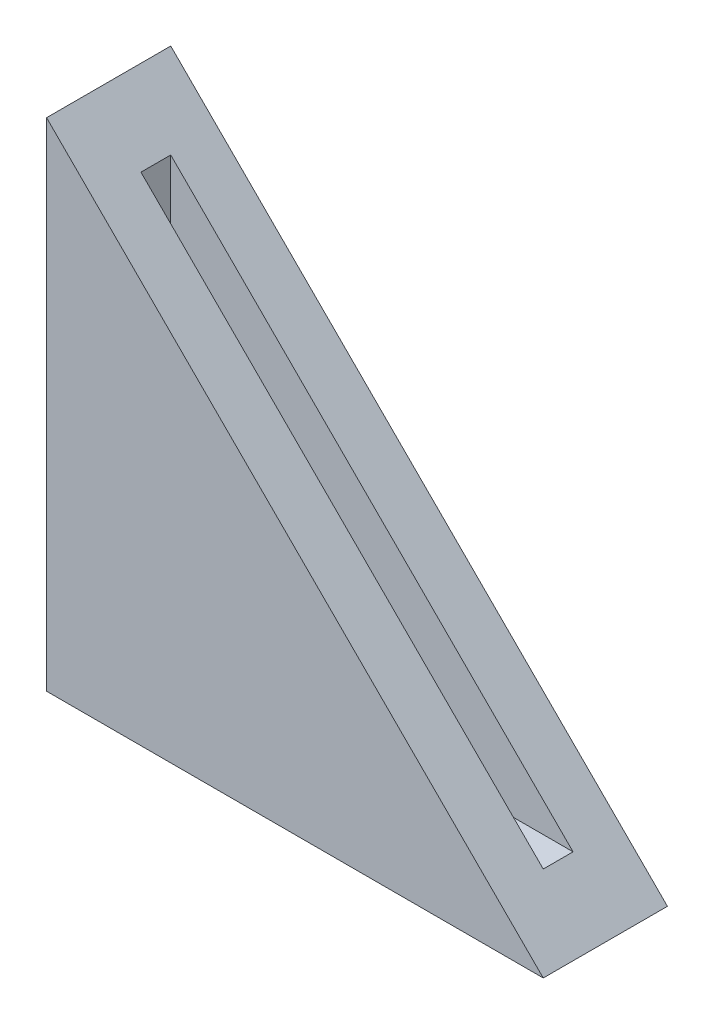
ISO-10303-21;
HEADER;
FILE_DESCRIPTION(('STEP AP214'),'2;1');
FILE_NAME('part.step','',(''),(''),'','','');
FILE_SCHEMA(('AUTOMOTIVE_DESIGN { 1 0 10303 214 1 1 1 1 }'));
ENDSEC;
DATA;
#1=APPLICATION_CONTEXT('core data for automotive mechanical design processes');
#2=APPLICATION_PROTOCOL_DEFINITION('international standard','automotive_design',2000,#1);
#3=PRODUCT_CONTEXT('',#1,'mechanical');
#4=PRODUCT('Part','Part','',(#3));
#5=PRODUCT_RELATED_PRODUCT_CATEGORY('part','',(#4));
#6=PRODUCT_DEFINITION_FORMATION('','',#4);
#7=PRODUCT_DEFINITION_CONTEXT('part definition',#1,'design');
#8=PRODUCT_DEFINITION('design','',#6,#7);
#9=PRODUCT_DEFINITION_SHAPE('','',#8);
#10=(LENGTH_UNIT() NAMED_UNIT(*) SI_UNIT(.MILLI.,.METRE.));
#11=(NAMED_UNIT(*) PLANE_ANGLE_UNIT() SI_UNIT($,.RADIAN.));
#12=(NAMED_UNIT(*) SI_UNIT($,.STERADIAN.) SOLID_ANGLE_UNIT());
#13=UNCERTAINTY_MEASURE_WITH_UNIT(LENGTH_MEASURE(1.E-05),#10,'distance_accuracy_value','');
#14=(GEOMETRIC_REPRESENTATION_CONTEXT(3) GLOBAL_UNCERTAINTY_ASSIGNED_CONTEXT((#13)) GLOBAL_UNIT_ASSIGNED_CONTEXT((#10,
#11,#12)) REPRESENTATION_CONTEXT('',''));
#15=CARTESIAN_POINT('',(0.,0.,0.));
#16=DIRECTION('',(0.,0.,1.));
#17=DIRECTION('',(1.,0.,0.));
#18=AXIS2_PLACEMENT_3D('',#15,#16,#17);
#19=CARTESIAN_POINT('',(0.,60.,7.5));
#20=DIRECTION('',(-0.707106781186547,-0.707106781186547,0.));
#21=DIRECTION('',(0.707106781186548,-0.707106781186548,0.));
#22=AXIS2_PLACEMENT_3D('',#19,#20,#21);
#23=PLANE('',#22);
#24=DIRECTION('',(0.,0.,-1.));
#25=VECTOR('',#24,1.);
#26=CARTESIAN_POINT('',(60.,0.,7.5));
#27=LINE('',#26,#25);
#28=CARTESIAN_POINT('',(60.,0.,7.5));
#29=VERTEX_POINT('',#28);
#30=CARTESIAN_POINT('',(60.,0.,-7.5));
#31=VERTEX_POINT('',#30);
#32=EDGE_CURVE('E128',#29,#31,#27,.T.);
#33=ORIENTED_EDGE('',*,*,#32,.T.);
#34=DIRECTION('',(0.707106781186547,-0.707106781186547,0.));
#35=VECTOR('',#34,1.);
#36=CARTESIAN_POINT('',(0.,60.,-7.5));
#37=LINE('',#36,#35);
#38=CARTESIAN_POINT('',(0.,60.,-7.5));
#39=VERTEX_POINT('',#38);
#40=EDGE_CURVE('E103',#39,#31,#37,.T.);
#41=ORIENTED_EDGE('',*,*,#40,.F.);
#42=DIRECTION('',(0.,0.,-1.));
#43=VECTOR('',#42,1.);
#44=CARTESIAN_POINT('',(0.,60.,7.5));
#45=LINE('',#44,#43);
#46=CARTESIAN_POINT('',(0.,60.,7.5));
#47=VERTEX_POINT('',#46);
#48=EDGE_CURVE('E126',#47,#39,#45,.T.);
#49=ORIENTED_EDGE('',*,*,#48,.F.);
#50=DIRECTION('',(-0.707106781186547,0.707106781186547,0.));
#51=VECTOR('',#50,1.);
#52=CARTESIAN_POINT('',(0.,60.,7.5));
#53=LINE('',#52,#51);
#54=EDGE_CURVE('E121',#29,#47,#53,.T.);
#55=ORIENTED_EDGE('',*,*,#54,.F.);
#56=EDGE_LOOP('',(#33,#41,#49,#55));
#57=FACE_BOUND('',#56,.T.);
#58=DIRECTION('',(0.707106781186548,-0.707106781186548,0.));
#59=VECTOR('',#58,1.);
#60=CARTESIAN_POINT('',(0.,60.,1.8));
#61=LINE('',#60,#59);
#62=CARTESIAN_POINT('',(5.7,54.3,1.8));
#63=VERTEX_POINT('',#62);
#64=CARTESIAN_POINT('',(54.3,5.69999999999999,1.8));
#65=VERTEX_POINT('',#64);
#66=EDGE_CURVE('E11',#63,#65,#61,.T.);
#67=ORIENTED_EDGE('',*,*,#66,.F.);
#68=DIRECTION('',(0.,0.,1.));
#69=VECTOR('',#68,1.);
#70=CARTESIAN_POINT('',(5.7,54.3,7.5));
#71=LINE('',#70,#69);
#72=CARTESIAN_POINT('',(5.7,54.3,-1.8));
#73=VERTEX_POINT('',#72);
#74=EDGE_CURVE('E131',#73,#63,#71,.T.);
#75=ORIENTED_EDGE('',*,*,#74,.F.);
#76=DIRECTION('',(0.707106781186548,-0.707106781186548,0.));
#77=VECTOR('',#76,1.);
#78=CARTESIAN_POINT('',(0.,60.,-1.8));
#79=LINE('',#78,#77);
#80=CARTESIAN_POINT('',(54.3,5.7,-1.8));
#81=VERTEX_POINT('',#80);
#82=EDGE_CURVE('E90',#73,#81,#79,.T.);
#83=ORIENTED_EDGE('',*,*,#82,.T.);
#84=DIRECTION('',(0.,0.,-1.));
#85=VECTOR('',#84,1.);
#86=CARTESIAN_POINT('',(54.3,5.7,7.5));
#87=LINE('',#86,#85);
#88=EDGE_CURVE('E43',#65,#81,#87,.T.);
#89=ORIENTED_EDGE('',*,*,#88,.F.);
#90=EDGE_LOOP('',(#67,#75,#83,#89));
#91=FACE_BOUND('',#90,.T.);
#92=ADVANCED_FACE('F35',(#57,#91),#23,.F.);
#93=CARTESIAN_POINT('',(0.,0.,7.5));
#94=DIRECTION('',(0.,1.,0.));
#95=DIRECTION('',(0.,0.,1.));
#96=AXIS2_PLACEMENT_3D('',#93,#94,#95);
#97=PLANE('',#96);
#98=DIRECTION('',(0.,0.,-1.));
#99=VECTOR('',#98,1.);
#100=CARTESIAN_POINT('',(0.,0.,7.5));
#101=LINE('',#100,#99);
#102=CARTESIAN_POINT('',(0.,0.,7.5));
#103=VERTEX_POINT('',#102);
#104=CARTESIAN_POINT('',(0.,0.,-7.5));
#105=VERTEX_POINT('',#104);
#106=EDGE_CURVE('E124',#103,#105,#101,.T.);
#107=ORIENTED_EDGE('',*,*,#106,.T.);
#108=DIRECTION('',(-1.,0.,0.));
#109=VECTOR('',#108,1.);
#110=CARTESIAN_POINT('',(60.,0.,-7.5));
#111=LINE('',#110,#109);
#112=EDGE_CURVE('E113',#31,#105,#111,.T.);
#113=ORIENTED_EDGE('',*,*,#112,.F.);
#114=ORIENTED_EDGE('',*,*,#32,.F.);
#115=DIRECTION('',(1.,0.,0.));
#116=VECTOR('',#115,1.);
#117=CARTESIAN_POINT('',(0.,0.,7.5));
#118=LINE('',#117,#116);
#119=EDGE_CURVE('E119',#103,#29,#118,.T.);
#120=ORIENTED_EDGE('',*,*,#119,.F.);
#121=EDGE_LOOP('',(#107,#113,#114,#120));
#122=FACE_BOUND('',#121,.T.);
#123=ADVANCED_FACE('F37',(#122),#97,.F.);
#124=CARTESIAN_POINT('',(0.,0.,7.5));
#125=DIRECTION('',(1.,0.,0.));
#126=DIRECTION('',(0.,0.,-1.));
#127=AXIS2_PLACEMENT_3D('',#124,#125,#126);
#128=PLANE('',#127);
#129=ORIENTED_EDGE('',*,*,#48,.T.);
#130=DIRECTION('',(0.,1.,0.));
#131=VECTOR('',#130,1.);
#132=CARTESIAN_POINT('',(0.,0.,-7.5));
#133=LINE('',#132,#131);
#134=EDGE_CURVE('E116',#105,#39,#133,.T.);
#135=ORIENTED_EDGE('',*,*,#134,.F.);
#136=ORIENTED_EDGE('',*,*,#106,.F.);
#137=DIRECTION('',(0.,-1.,0.));
#138=VECTOR('',#137,1.);
#139=CARTESIAN_POINT('',(0.,0.,7.5));
#140=LINE('',#139,#138);
#141=EDGE_CURVE('E58',#47,#103,#140,.T.);
#142=ORIENTED_EDGE('',*,*,#141,.F.);
#143=EDGE_LOOP('',(#129,#135,#136,#142));
#144=FACE_BOUND('',#143,.T.);
#145=ADVANCED_FACE('F141',(#144),#128,.F.);
#146=CARTESIAN_POINT('',(0.,0.,7.5));
#147=DIRECTION('',(0.,0.,1.));
#148=DIRECTION('',(1.,0.,0.));
#149=AXIS2_PLACEMENT_3D('',#146,#147,#148);
#150=PLANE('',#149);
#151=ORIENTED_EDGE('',*,*,#119,.T.);
#152=ORIENTED_EDGE('',*,*,#54,.T.);
#153=ORIENTED_EDGE('',*,*,#141,.T.);
#154=EDGE_LOOP('',(#151,#152,#153));
#155=FACE_BOUND('',#154,.T.);
#156=ADVANCED_FACE('F146',(#155),#150,.T.);
#157=CARTESIAN_POINT('',(0.,0.,-7.5));
#158=DIRECTION('',(0.,0.,-1.));
#159=DIRECTION('',(-1.,0.,0.));
#160=AXIS2_PLACEMENT_3D('',#157,#158,#159);
#161=PLANE('',#160);
#162=ORIENTED_EDGE('',*,*,#40,.T.);
#163=ORIENTED_EDGE('',*,*,#112,.T.);
#164=ORIENTED_EDGE('',*,*,#134,.T.);
#165=EDGE_LOOP('',(#162,#163,#164));
#166=FACE_BOUND('',#165,.T.);
#167=ADVANCED_FACE('F150',(#166),#161,.T.);
#168=CARTESIAN_POINT('',(19.7998866260745,5.7,1.8));
#169=DIRECTION('',(0.,1.,0.));
#170=DIRECTION('',(0.,0.,1.));
#171=AXIS2_PLACEMENT_3D('',#168,#169,#170);
#172=PLANE('',#171);
#173=ORIENTED_EDGE('',*,*,#88,.T.);
#174=DIRECTION('',(1.,0.,0.));
#175=VECTOR('',#174,1.);
#176=CARTESIAN_POINT('',(5.70000000000001,5.7,-1.8));
#177=LINE('',#176,#175);
#178=CARTESIAN_POINT('',(5.70000000000001,5.7,-1.8));
#179=VERTEX_POINT('',#178);
#180=EDGE_CURVE('E50',#179,#81,#177,.T.);
#181=ORIENTED_EDGE('',*,*,#180,.F.);
#182=DIRECTION('',(0.,0.,-1.));
#183=VECTOR('',#182,1.);
#184=CARTESIAN_POINT('',(5.70000000000001,5.7,1.8));
#185=LINE('',#184,#183);
#186=CARTESIAN_POINT('',(5.70000000000001,5.7,1.8));
#187=VERTEX_POINT('',#186);
#188=EDGE_CURVE('E96',#187,#179,#185,.T.);
#189=ORIENTED_EDGE('',*,*,#188,.F.);
#190=DIRECTION('',(1.,0.,0.));
#191=VECTOR('',#190,1.);
#192=CARTESIAN_POINT('',(5.70000000000001,5.7,1.8));
#193=LINE('',#192,#191);
#194=EDGE_CURVE('E93',#187,#65,#193,.T.);
#195=ORIENTED_EDGE('',*,*,#194,.T.);
#196=EDGE_LOOP('',(#173,#181,#189,#195));
#197=FACE_BOUND('',#196,.T.);
#198=ADVANCED_FACE('F105',(#197),#172,.T.);
#199=CARTESIAN_POINT('',(5.7,19.9891411862653,1.8));
#200=DIRECTION('',(1.,0.,0.));
#201=DIRECTION('',(0.,1.,0.));
#202=AXIS2_PLACEMENT_3D('',#199,#200,#201);
#203=PLANE('',#202);
#204=ORIENTED_EDGE('',*,*,#74,.T.);
#205=DIRECTION('',(0.,-1.,0.));
#206=VECTOR('',#205,1.);
#207=CARTESIAN_POINT('',(5.7,61.2809250759496,1.8));
#208=LINE('',#207,#206);
#209=EDGE_CURVE('E99',#63,#187,#208,.T.);
#210=ORIENTED_EDGE('',*,*,#209,.T.);
#211=ORIENTED_EDGE('',*,*,#188,.T.);
#212=DIRECTION('',(0.,-1.,0.));
#213=VECTOR('',#212,1.);
#214=CARTESIAN_POINT('',(5.7,61.2809250759496,-1.8));
#215=LINE('',#214,#213);
#216=EDGE_CURVE('E86',#73,#179,#215,.T.);
#217=ORIENTED_EDGE('',*,*,#216,.F.);
#218=EDGE_LOOP('',(#204,#210,#211,#217));
#219=FACE_BOUND('',#218,.T.);
#220=ADVANCED_FACE('F97',(#219),#203,.T.);
#221=CARTESIAN_POINT('',(0.,0.,1.8));
#222=DIRECTION('',(0.,0.,-1.));
#223=DIRECTION('',(-1.,0.,0.));
#224=AXIS2_PLACEMENT_3D('',#221,#222,#223);
#225=PLANE('',#224);
#226=ORIENTED_EDGE('',*,*,#66,.T.);
#227=ORIENTED_EDGE('',*,*,#194,.F.);
#228=ORIENTED_EDGE('',*,*,#209,.F.);
#229=EDGE_LOOP('',(#226,#227,#228));
#230=FACE_BOUND('',#229,.T.);
#231=ADVANCED_FACE('F135',(#230),#225,.T.);
#232=CARTESIAN_POINT('',(0.,0.,-1.8));
#233=DIRECTION('',(0.,0.,-1.));
#234=DIRECTION('',(-1.,0.,0.));
#235=AXIS2_PLACEMENT_3D('',#232,#233,#234);
#236=PLANE('',#235);
#237=ORIENTED_EDGE('',*,*,#216,.T.);
#238=ORIENTED_EDGE('',*,*,#180,.T.);
#239=ORIENTED_EDGE('',*,*,#82,.F.);
#240=EDGE_LOOP('',(#237,#238,#239));
#241=FACE_BOUND('',#240,.T.);
#242=ADVANCED_FACE('F88',(#241),#236,.F.);
#243=CLOSED_SHELL('',(#92,#123,#145,#156,#167,#198,#220,#231,#242));
#244=MANIFOLD_SOLID_BREP('B2',#243);
#245=ADVANCED_BREP_SHAPE_REPRESENTATION('',(#18,#244),#14);
#246=SHAPE_DEFINITION_REPRESENTATION(#9,#245);
ENDSEC;
END-ISO-10303-21;
